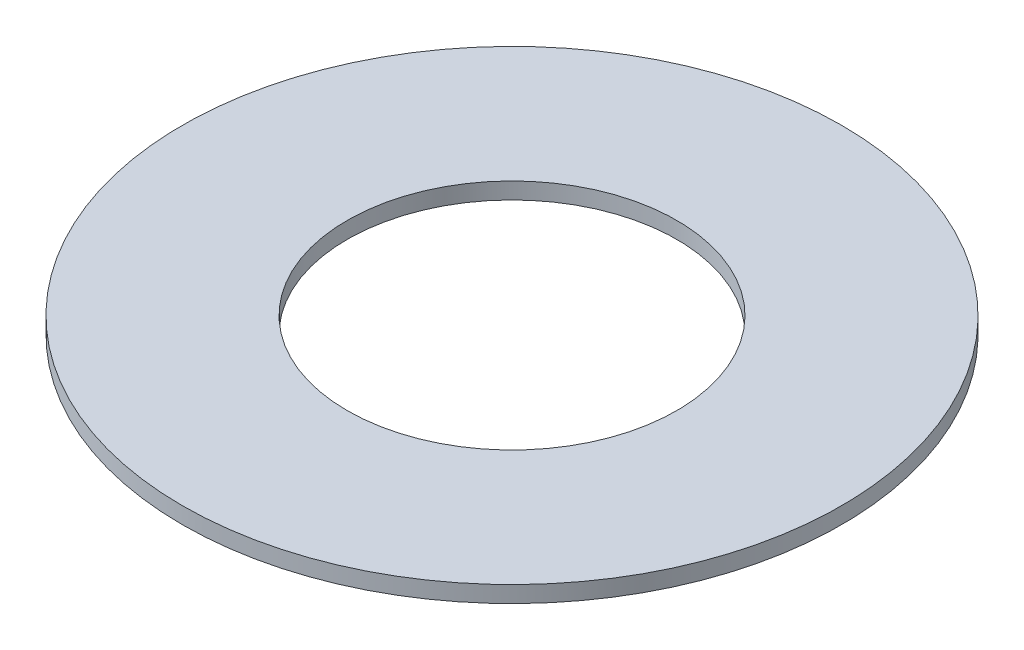
ISO-10303-21;
HEADER;
FILE_DESCRIPTION(('STEP AP214'),'2;1');
FILE_NAME('part.step','',(''),(''),'','','');
FILE_SCHEMA(('AUTOMOTIVE_DESIGN { 1 0 10303 214 1 1 1 1 }'));
ENDSEC;
DATA;
#1=APPLICATION_CONTEXT('core data for automotive mechanical design processes');
#2=APPLICATION_PROTOCOL_DEFINITION('international standard','automotive_design',2000,#1);
#3=PRODUCT_CONTEXT('',#1,'mechanical');
#4=PRODUCT('Part','Part','',(#3));
#5=PRODUCT_RELATED_PRODUCT_CATEGORY('part','',(#4));
#6=PRODUCT_DEFINITION_FORMATION('','',#4);
#7=PRODUCT_DEFINITION_CONTEXT('part definition',#1,'design');
#8=PRODUCT_DEFINITION('design','',#6,#7);
#9=PRODUCT_DEFINITION_SHAPE('','',#8);
#10=(LENGTH_UNIT() NAMED_UNIT(*) SI_UNIT(.MILLI.,.METRE.));
#11=(NAMED_UNIT(*) PLANE_ANGLE_UNIT() SI_UNIT($,.RADIAN.));
#12=(NAMED_UNIT(*) SI_UNIT($,.STERADIAN.) SOLID_ANGLE_UNIT());
#13=UNCERTAINTY_MEASURE_WITH_UNIT(LENGTH_MEASURE(1.E-05),#10,'distance_accuracy_value','');
#14=(GEOMETRIC_REPRESENTATION_CONTEXT(3) GLOBAL_UNCERTAINTY_ASSIGNED_CONTEXT((#13)) GLOBAL_UNIT_ASSIGNED_CONTEXT((#10,
#11,#12)) REPRESENTATION_CONTEXT('',''));
#15=CARTESIAN_POINT('',(0.,0.,0.));
#16=DIRECTION('',(0.,0.,1.));
#17=DIRECTION('',(1.,0.,0.));
#18=AXIS2_PLACEMENT_3D('',#15,#16,#17);
#19=CARTESIAN_POINT('',(0.,0.1,0.));
#20=DIRECTION('',(0.,1.,0.));
#21=DIRECTION('',(0.,0.,1.));
#22=AXIS2_PLACEMENT_3D('',#19,#20,#21);
#23=PLANE('',#22);
#24=CARTESIAN_POINT('',(0.,0.1,0.));
#25=DIRECTION('',(0.,1.,0.));
#26=DIRECTION('',(0.,0.,1.));
#27=AXIS2_PLACEMENT_3D('',#24,#25,#26);
#28=CIRCLE('',#27,2.);
#29=CARTESIAN_POINT('',(0.,0.1,2.));
#30=VERTEX_POINT('',#29);
#31=EDGE_CURVE('E10',#30,#30,#28,.T.);
#32=ORIENTED_EDGE('',*,*,#31,.T.);
#33=EDGE_LOOP('',(#32));
#34=FACE_BOUND('',#33,.T.);
#35=CARTESIAN_POINT('',(0.,0.1,0.));
#36=DIRECTION('',(0.,1.,0.));
#37=DIRECTION('',(0.,0.,1.));
#38=AXIS2_PLACEMENT_3D('',#35,#36,#37);
#39=CIRCLE('',#38,0.999999999999999);
#40=CARTESIAN_POINT('',(0.,0.1,0.999999999999999));
#41=VERTEX_POINT('',#40);
#42=EDGE_CURVE('E42',#41,#41,#39,.T.);
#43=ORIENTED_EDGE('',*,*,#42,.F.);
#44=EDGE_LOOP('',(#43));
#45=FACE_BOUND('',#44,.T.);
#46=ADVANCED_FACE('F31',(#34,#45),#23,.T.);
#47=CARTESIAN_POINT('',(0.,0.,0.));
#48=DIRECTION('',(0.,1.,0.));
#49=DIRECTION('',(0.,0.,1.));
#50=AXIS2_PLACEMENT_3D('',#47,#48,#49);
#51=PLANE('',#50);
#52=CARTESIAN_POINT('',(0.,0.,0.));
#53=DIRECTION('',(0.,1.,0.));
#54=DIRECTION('',(0.,0.,1.));
#55=AXIS2_PLACEMENT_3D('',#52,#53,#54);
#56=CIRCLE('',#55,2.);
#57=CARTESIAN_POINT('',(0.,0.,2.));
#58=VERTEX_POINT('',#57);
#59=EDGE_CURVE('E35',#58,#58,#56,.T.);
#60=ORIENTED_EDGE('',*,*,#59,.F.);
#61=EDGE_LOOP('',(#60));
#62=FACE_BOUND('',#61,.T.);
#63=CARTESIAN_POINT('',(0.,0.,0.));
#64=DIRECTION('',(0.,1.,0.));
#65=DIRECTION('',(0.,0.,1.));
#66=AXIS2_PLACEMENT_3D('',#63,#64,#65);
#67=CIRCLE('',#66,0.999999999999999);
#68=CARTESIAN_POINT('',(0.,0.,0.999999999999999));
#69=VERTEX_POINT('',#68);
#70=EDGE_CURVE('E44',#69,#69,#67,.T.);
#71=ORIENTED_EDGE('',*,*,#70,.T.);
#72=EDGE_LOOP('',(#71));
#73=FACE_BOUND('',#72,.T.);
#74=ADVANCED_FACE('F54',(#62,#73),#51,.F.);
#75=CARTESIAN_POINT('',(0.,0.1,0.));
#76=DIRECTION('',(0.,-1.,0.));
#77=DIRECTION('',(0.,0.,-1.));
#78=AXIS2_PLACEMENT_3D('',#75,#76,#77);
#79=CYLINDRICAL_SURFACE('',#78,2.);
#80=ORIENTED_EDGE('',*,*,#31,.F.);
#81=EDGE_LOOP('',(#80));
#82=FACE_BOUND('',#81,.T.);
#83=ORIENTED_EDGE('',*,*,#59,.T.);
#84=EDGE_LOOP('',(#83));
#85=FACE_BOUND('',#84,.T.);
#86=ADVANCED_FACE('F33',(#82,#85),#79,.T.);
#87=CARTESIAN_POINT('',(0.,0.1,0.));
#88=DIRECTION('',(0.,-1.,0.));
#89=DIRECTION('',(0.,0.,-1.));
#90=AXIS2_PLACEMENT_3D('',#87,#88,#89);
#91=CYLINDRICAL_SURFACE('',#90,0.999999999999999);
#92=ORIENTED_EDGE('',*,*,#42,.T.);
#93=EDGE_LOOP('',(#92));
#94=FACE_BOUND('',#93,.T.);
#95=ORIENTED_EDGE('',*,*,#70,.F.);
#96=EDGE_LOOP('',(#95));
#97=FACE_BOUND('',#96,.T.);
#98=ADVANCED_FACE('F50',(#94,#97),#91,.F.);
#99=CLOSED_SHELL('',(#46,#74,#86,#98));
#100=MANIFOLD_SOLID_BREP('B2',#99);
#101=ADVANCED_BREP_SHAPE_REPRESENTATION('',(#18,#100),#14);
#102=SHAPE_DEFINITION_REPRESENTATION(#9,#101);
ENDSEC;
END-ISO-10303-21;
